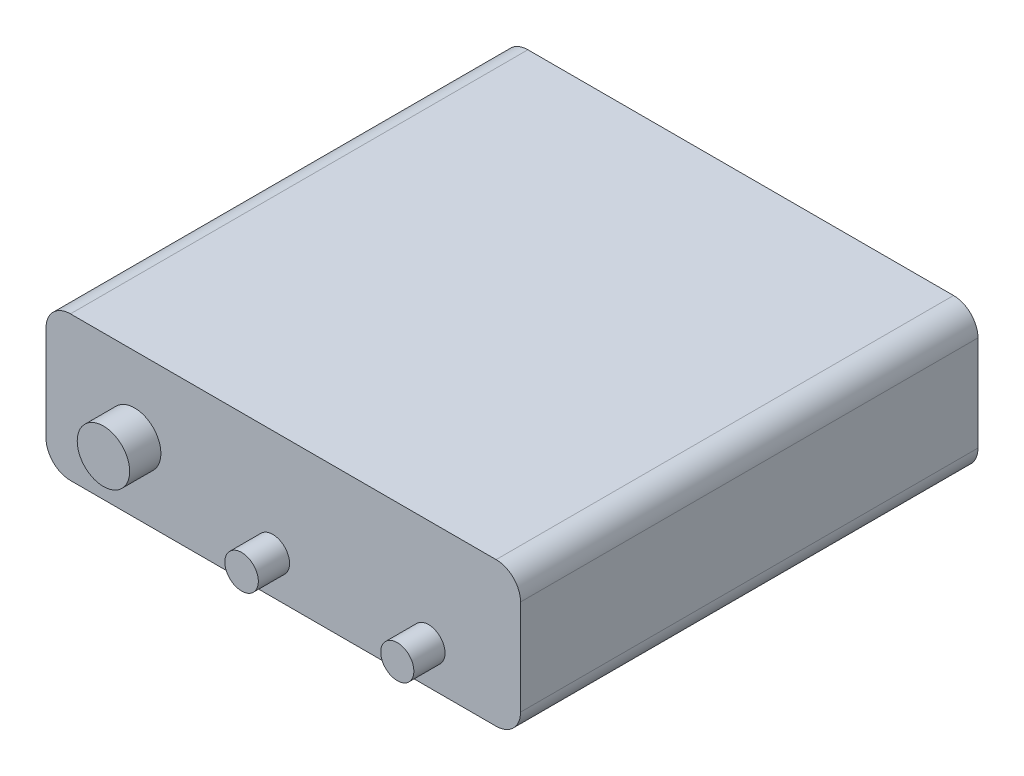
ISO-10303-21;
HEADER;
FILE_DESCRIPTION(('STEP AP214'),'2;1');
FILE_NAME('part.step','',(''),(''),'','','');
FILE_SCHEMA(('AUTOMOTIVE_DESIGN { 1 0 10303 214 1 1 1 1 }'));
ENDSEC;
DATA;
#1=APPLICATION_CONTEXT('core data for automotive mechanical design processes');
#2=APPLICATION_PROTOCOL_DEFINITION('international standard','automotive_design',2000,#1);
#3=PRODUCT_CONTEXT('',#1,'mechanical');
#4=PRODUCT('Part','Part','',(#3));
#5=PRODUCT_RELATED_PRODUCT_CATEGORY('part','',(#4));
#6=PRODUCT_DEFINITION_FORMATION('','',#4);
#7=PRODUCT_DEFINITION_CONTEXT('part definition',#1,'design');
#8=PRODUCT_DEFINITION('design','',#6,#7);
#9=PRODUCT_DEFINITION_SHAPE('','',#8);
#10=(LENGTH_UNIT() NAMED_UNIT(*) SI_UNIT(.MILLI.,.METRE.));
#11=(NAMED_UNIT(*) PLANE_ANGLE_UNIT() SI_UNIT($,.RADIAN.));
#12=(NAMED_UNIT(*) SI_UNIT($,.STERADIAN.) SOLID_ANGLE_UNIT());
#13=UNCERTAINTY_MEASURE_WITH_UNIT(LENGTH_MEASURE(1.E-05),#10,'distance_accuracy_value','');
#14=(GEOMETRIC_REPRESENTATION_CONTEXT(3) GLOBAL_UNCERTAINTY_ASSIGNED_CONTEXT((#13)) GLOBAL_UNIT_ASSIGNED_CONTEXT((#10,
#11,#12)) REPRESENTATION_CONTEXT('',''));
#15=CARTESIAN_POINT('',(0.,0.,0.));
#16=DIRECTION('',(0.,0.,1.));
#17=DIRECTION('',(1.,0.,0.));
#18=AXIS2_PLACEMENT_3D('',#15,#16,#17);
#19=CARTESIAN_POINT('',(0.,59.944,0.));
#20=DIRECTION('',(-1.,0.,0.));
#21=DIRECTION('',(0.,0.,1.));
#22=AXIS2_PLACEMENT_3D('',#19,#20,#21);
#23=PLANE('',#22);
#24=DIRECTION('',(0.,-1.,0.));
#25=VECTOR('',#24,1.);
#26=CARTESIAN_POINT('',(0.,59.944,189.992));
#27=LINE('',#26,#25);
#28=CARTESIAN_POINT('',(0.,49.784,189.992));
#29=VERTEX_POINT('',#28);
#30=CARTESIAN_POINT('',(0.,10.16,189.992));
#31=VERTEX_POINT('',#30);
#32=EDGE_CURVE('E130',#29,#31,#27,.T.);
#33=ORIENTED_EDGE('',*,*,#32,.T.);
#34=DIRECTION('',(0.,0.,-1.));
#35=VECTOR('',#34,1.);
#36=CARTESIAN_POINT('',(0.,10.16,0.));
#37=LINE('',#36,#35);
#38=CARTESIAN_POINT('',(0.,10.16,0.));
#39=VERTEX_POINT('',#38);
#40=EDGE_CURVE('E150',#31,#39,#37,.T.);
#41=ORIENTED_EDGE('',*,*,#40,.T.);
#42=DIRECTION('',(0.,-1.,0.));
#43=VECTOR('',#42,1.);
#44=CARTESIAN_POINT('',(0.,59.944,0.));
#45=LINE('',#44,#43);
#46=CARTESIAN_POINT('',(0.,49.784,0.));
#47=VERTEX_POINT('',#46);
#48=EDGE_CURVE('E122',#47,#39,#45,.T.);
#49=ORIENTED_EDGE('',*,*,#48,.F.);
#50=DIRECTION('',(0.,0.,-1.));
#51=VECTOR('',#50,1.);
#52=CARTESIAN_POINT('',(0.,49.784,0.));
#53=LINE('',#52,#51);
#54=EDGE_CURVE('E107',#47,#29,#53,.F.);
#55=ORIENTED_EDGE('',*,*,#54,.T.);
#56=EDGE_LOOP('',(#33,#41,#49,#55));
#57=FACE_BOUND('',#56,.T.);
#58=ADVANCED_FACE('F36',(#57),#23,.F.);
#59=CARTESIAN_POINT('',(0.,59.944,0.));
#60=DIRECTION('',(0.,0.,1.));
#61=DIRECTION('',(1.,0.,0.));
#62=AXIS2_PLACEMENT_3D('',#59,#60,#61);
#63=PLANE('',#62);
#64=DIRECTION('',(-1.,0.,0.));
#65=VECTOR('',#64,1.);
#66=CARTESIAN_POINT('',(0.,0.,0.));
#67=LINE('',#66,#65);
#68=CARTESIAN_POINT('',(-10.16,0.,0.));
#69=VERTEX_POINT('',#68);
#70=CARTESIAN_POINT('',(-186.944,0.,0.));
#71=VERTEX_POINT('',#70);
#72=EDGE_CURVE('E132',#69,#71,#67,.T.);
#73=ORIENTED_EDGE('',*,*,#72,.T.);
#74=CARTESIAN_POINT('',(-186.944,10.16,0.));
#75=DIRECTION('',(0.,0.,1.));
#76=DIRECTION('',(1.,0.,0.));
#77=AXIS2_PLACEMENT_3D('',#74,#75,#76);
#78=CIRCLE('',#77,10.16);
#79=CARTESIAN_POINT('',(-197.104,10.16,0.));
#80=VERTEX_POINT('',#79);
#81=EDGE_CURVE('E172',#71,#80,#78,.F.);
#82=ORIENTED_EDGE('',*,*,#81,.T.);
#83=DIRECTION('',(0.,-1.,0.));
#84=VECTOR('',#83,1.);
#85=CARTESIAN_POINT('',(-197.104,59.944,0.));
#86=LINE('',#85,#84);
#87=CARTESIAN_POINT('',(-197.104,49.784,0.));
#88=VERTEX_POINT('',#87);
#89=EDGE_CURVE('E143',#88,#80,#86,.T.);
#90=ORIENTED_EDGE('',*,*,#89,.F.);
#91=CARTESIAN_POINT('',(-186.944,49.784,0.));
#92=DIRECTION('',(0.,0.,1.));
#93=DIRECTION('',(1.,0.,0.));
#94=AXIS2_PLACEMENT_3D('',#91,#92,#93);
#95=CIRCLE('',#94,10.16);
#96=CARTESIAN_POINT('',(-186.944,59.944,0.));
#97=VERTEX_POINT('',#96);
#98=EDGE_CURVE('E127',#88,#97,#95,.F.);
#99=ORIENTED_EDGE('',*,*,#98,.T.);
#100=DIRECTION('',(-1.,0.,0.));
#101=VECTOR('',#100,1.);
#102=CARTESIAN_POINT('',(0.,59.944,0.));
#103=LINE('',#102,#101);
#104=CARTESIAN_POINT('',(-10.16,59.944,0.));
#105=VERTEX_POINT('',#104);
#106=EDGE_CURVE('E117',#105,#97,#103,.T.);
#107=ORIENTED_EDGE('',*,*,#106,.F.);
#108=CARTESIAN_POINT('',(-10.16,49.784,0.));
#109=DIRECTION('',(0.,0.,1.));
#110=DIRECTION('',(1.,0.,0.));
#111=AXIS2_PLACEMENT_3D('',#108,#109,#110);
#112=CIRCLE('',#111,10.16);
#113=EDGE_CURVE('E102',#105,#47,#112,.F.);
#114=ORIENTED_EDGE('',*,*,#113,.T.);
#115=ORIENTED_EDGE('',*,*,#48,.T.);
#116=CARTESIAN_POINT('',(-10.16,10.16,0.));
#117=DIRECTION('',(0.,0.,1.));
#118=DIRECTION('',(1.,0.,0.));
#119=AXIS2_PLACEMENT_3D('',#116,#117,#118);
#120=CIRCLE('',#119,10.16);
#121=EDGE_CURVE('E153',#39,#69,#120,.F.);
#122=ORIENTED_EDGE('',*,*,#121,.T.);
#123=EDGE_LOOP('',(#73,#82,#90,#99,#107,#114,#115,#122));
#124=FACE_BOUND('',#123,.T.);
#125=ADVANCED_FACE('F124',(#124),#63,.F.);
#126=CARTESIAN_POINT('',(-197.104,59.944,0.));
#127=DIRECTION('',(1.,0.,0.));
#128=DIRECTION('',(0.,0.,-1.));
#129=AXIS2_PLACEMENT_3D('',#126,#127,#128);
#130=PLANE('',#129);
#131=ORIENTED_EDGE('',*,*,#89,.T.);
#132=DIRECTION('',(0.,0.,1.));
#133=VECTOR('',#132,1.);
#134=CARTESIAN_POINT('',(-197.104,10.16,189.992));
#135=LINE('',#134,#133);
#136=CARTESIAN_POINT('',(-197.104,10.16,189.992));
#137=VERTEX_POINT('',#136);
#138=EDGE_CURVE('E167',#80,#137,#135,.T.);
#139=ORIENTED_EDGE('',*,*,#138,.T.);
#140=DIRECTION('',(0.,-1.,0.));
#141=VECTOR('',#140,1.);
#142=CARTESIAN_POINT('',(-197.104,59.944,189.992));
#143=LINE('',#142,#141);
#144=CARTESIAN_POINT('',(-197.104,49.784,189.992));
#145=VERTEX_POINT('',#144);
#146=EDGE_CURVE('E141',#145,#137,#143,.T.);
#147=ORIENTED_EDGE('',*,*,#146,.F.);
#148=DIRECTION('',(0.,0.,1.));
#149=VECTOR('',#148,1.);
#150=CARTESIAN_POINT('',(-197.104,49.784,0.));
#151=LINE('',#150,#149);
#152=EDGE_CURVE('E164',#145,#88,#151,.F.);
#153=ORIENTED_EDGE('',*,*,#152,.T.);
#154=EDGE_LOOP('',(#131,#139,#147,#153));
#155=FACE_BOUND('',#154,.T.);
#156=ADVANCED_FACE('F184',(#155),#130,.F.);
#157=CARTESIAN_POINT('',(0.,59.944,189.992));
#158=DIRECTION('',(0.,0.,-1.));
#159=DIRECTION('',(-1.,0.,0.));
#160=AXIS2_PLACEMENT_3D('',#157,#158,#159);
#161=PLANE('',#160);
#162=CARTESIAN_POINT('',(-38.24316685751,15.6747262686382,189.992));
#163=DIRECTION('',(0.,0.,-1.));
#164=DIRECTION('',(-1.,0.,0.));
#165=AXIS2_PLACEMENT_3D('',#162,#163,#164);
#166=CIRCLE('',#165,6.87161730386582);
#167=CARTESIAN_POINT('',(-45.1147841613758,15.6747262686382,189.992));
#168=VERTEX_POINT('',#167);
#169=EDGE_CURVE('E11',#168,#168,#166,.F.);
#170=ORIENTED_EDGE('',*,*,#169,.F.);
#171=EDGE_LOOP('',(#170));
#172=FACE_BOUND('',#171,.T.);
#173=CARTESIAN_POINT('',(-102.91026687389,15.6747262686382,189.992));
#174=DIRECTION('',(0.,0.,-1.));
#175=DIRECTION('',(-1.,0.,0.));
#176=AXIS2_PLACEMENT_3D('',#173,#174,#175);
#177=CIRCLE('',#176,6.95669831574314);
#178=CARTESIAN_POINT('',(-109.866965189633,15.6747262686382,189.992));
#179=VERTEX_POINT('',#178);
#180=EDGE_CURVE('E44',#179,#179,#177,.F.);
#181=ORIENTED_EDGE('',*,*,#180,.F.);
#182=EDGE_LOOP('',(#181));
#183=FACE_BOUND('',#182,.T.);
#184=CARTESIAN_POINT('',(-160.289066683505,28.5286375423858,189.992));
#185=DIRECTION('',(0.,0.,-1.));
#186=DIRECTION('',(-1.,0.,0.));
#187=AXIS2_PLACEMENT_3D('',#184,#185,#186);
#188=CIRCLE('',#187,10.8928249125496);
#189=CARTESIAN_POINT('',(-171.181891596055,28.5286375423858,189.992));
#190=VERTEX_POINT('',#189);
#191=EDGE_CURVE('E174',#190,#190,#188,.F.);
#192=ORIENTED_EDGE('',*,*,#191,.F.);
#193=EDGE_LOOP('',(#192));
#194=FACE_BOUND('',#193,.T.);
#195=ORIENTED_EDGE('',*,*,#146,.T.);
#196=CARTESIAN_POINT('',(-186.944,10.16,189.992));
#197=DIRECTION('',(0.,0.,-1.));
#198=DIRECTION('',(-1.,0.,0.));
#199=AXIS2_PLACEMENT_3D('',#196,#197,#198);
#200=CIRCLE('',#199,10.16);
#201=CARTESIAN_POINT('',(-186.944,0.,189.992));
#202=VERTEX_POINT('',#201);
#203=EDGE_CURVE('E59',#137,#202,#200,.F.);
#204=ORIENTED_EDGE('',*,*,#203,.T.);
#205=DIRECTION('',(1.,0.,0.));
#206=VECTOR('',#205,1.);
#207=CARTESIAN_POINT('',(0.,0.,189.992));
#208=LINE('',#207,#206);
#209=CARTESIAN_POINT('',(-10.16,0.,189.992));
#210=VERTEX_POINT('',#209);
#211=EDGE_CURVE('E128',#202,#210,#208,.T.);
#212=ORIENTED_EDGE('',*,*,#211,.T.);
#213=CARTESIAN_POINT('',(-10.16,10.16,189.992));
#214=DIRECTION('',(0.,0.,-1.));
#215=DIRECTION('',(-1.,0.,0.));
#216=AXIS2_PLACEMENT_3D('',#213,#214,#215);
#217=CIRCLE('',#216,10.16);
#218=EDGE_CURVE('E158',#210,#31,#217,.F.);
#219=ORIENTED_EDGE('',*,*,#218,.T.);
#220=ORIENTED_EDGE('',*,*,#32,.F.);
#221=CARTESIAN_POINT('',(-10.16,49.784,189.992));
#222=DIRECTION('',(0.,0.,-1.));
#223=DIRECTION('',(-1.,0.,0.));
#224=AXIS2_PLACEMENT_3D('',#221,#222,#223);
#225=CIRCLE('',#224,10.16);
#226=CARTESIAN_POINT('',(-10.16,59.944,189.992));
#227=VERTEX_POINT('',#226);
#228=EDGE_CURVE('E148',#29,#227,#225,.F.);
#229=ORIENTED_EDGE('',*,*,#228,.T.);
#230=DIRECTION('',(1.,0.,0.));
#231=VECTOR('',#230,1.);
#232=CARTESIAN_POINT('',(0.,59.944,189.992));
#233=LINE('',#232,#231);
#234=CARTESIAN_POINT('',(-186.944,59.944,189.992));
#235=VERTEX_POINT('',#234);
#236=EDGE_CURVE('E120',#235,#227,#233,.T.);
#237=ORIENTED_EDGE('',*,*,#236,.F.);
#238=CARTESIAN_POINT('',(-186.944,49.784,189.992));
#239=DIRECTION('',(0.,0.,-1.));
#240=DIRECTION('',(-1.,0.,0.));
#241=AXIS2_PLACEMENT_3D('',#238,#239,#240);
#242=CIRCLE('',#241,10.16);
#243=EDGE_CURVE('E162',#235,#145,#242,.F.);
#244=ORIENTED_EDGE('',*,*,#243,.T.);
#245=EDGE_LOOP('',(#195,#204,#212,#219,#220,#229,#237,#244));
#246=FACE_BOUND('',#245,.T.);
#247=ADVANCED_FACE('F181',(#172,#183,#194,#246),#161,.F.);
#248=CARTESIAN_POINT('',(0.,59.944,0.));
#249=DIRECTION('',(0.,-1.,0.));
#250=DIRECTION('',(0.,0.,-1.));
#251=AXIS2_PLACEMENT_3D('',#248,#249,#250);
#252=PLANE('',#251);
#253=ORIENTED_EDGE('',*,*,#106,.T.);
#254=DIRECTION('',(0.,0.,1.));
#255=VECTOR('',#254,1.);
#256=CARTESIAN_POINT('',(-186.944,59.944,0.));
#257=LINE('',#256,#255);
#258=EDGE_CURVE('E160',#97,#235,#257,.T.);
#259=ORIENTED_EDGE('',*,*,#258,.T.);
#260=ORIENTED_EDGE('',*,*,#236,.T.);
#261=DIRECTION('',(0.,0.,-1.));
#262=VECTOR('',#261,1.);
#263=CARTESIAN_POINT('',(-10.16,59.944,0.));
#264=LINE('',#263,#262);
#265=EDGE_CURVE('E106',#227,#105,#264,.T.);
#266=ORIENTED_EDGE('',*,*,#265,.T.);
#267=EDGE_LOOP('',(#253,#259,#260,#266));
#268=FACE_BOUND('',#267,.T.);
#269=ADVANCED_FACE('F115',(#268),#252,.F.);
#270=CARTESIAN_POINT('',(0.,0.,0.));
#271=DIRECTION('',(0.,-1.,0.));
#272=DIRECTION('',(0.,0.,-1.));
#273=AXIS2_PLACEMENT_3D('',#270,#271,#272);
#274=PLANE('',#273);
#275=ORIENTED_EDGE('',*,*,#211,.F.);
#276=DIRECTION('',(0.,0.,1.));
#277=VECTOR('',#276,1.);
#278=CARTESIAN_POINT('',(-186.944,0.,0.));
#279=LINE('',#278,#277);
#280=EDGE_CURVE('E51',#202,#71,#279,.F.);
#281=ORIENTED_EDGE('',*,*,#280,.T.);
#282=ORIENTED_EDGE('',*,*,#72,.F.);
#283=DIRECTION('',(0.,0.,-1.));
#284=VECTOR('',#283,1.);
#285=CARTESIAN_POINT('',(-10.16,0.,189.992));
#286=LINE('',#285,#284);
#287=EDGE_CURVE('E155',#69,#210,#286,.F.);
#288=ORIENTED_EDGE('',*,*,#287,.T.);
#289=EDGE_LOOP('',(#275,#281,#282,#288));
#290=FACE_BOUND('',#289,.T.);
#291=ADVANCED_FACE('F202',(#290),#274,.T.);
#292=CARTESIAN_POINT('',(-10.16,49.784,0.));
#293=DIRECTION('',(0.,0.,-1.));
#294=DIRECTION('',(-1.,0.,0.));
#295=AXIS2_PLACEMENT_3D('',#292,#293,#294);
#296=CYLINDRICAL_SURFACE('',#295,10.16);
#297=ORIENTED_EDGE('',*,*,#228,.F.);
#298=ORIENTED_EDGE('',*,*,#54,.F.);
#299=ORIENTED_EDGE('',*,*,#113,.F.);
#300=ORIENTED_EDGE('',*,*,#265,.F.);
#301=EDGE_LOOP('',(#297,#298,#299,#300));
#302=FACE_BOUND('',#301,.T.);
#303=ADVANCED_FACE('F105',(#302),#296,.T.);
#304=CARTESIAN_POINT('',(-10.16,10.16,0.));
#305=DIRECTION('',(0.,0.,1.));
#306=DIRECTION('',(1.,0.,0.));
#307=AXIS2_PLACEMENT_3D('',#304,#305,#306);
#308=CYLINDRICAL_SURFACE('',#307,10.16);
#309=ORIENTED_EDGE('',*,*,#218,.F.);
#310=ORIENTED_EDGE('',*,*,#287,.F.);
#311=ORIENTED_EDGE('',*,*,#121,.F.);
#312=ORIENTED_EDGE('',*,*,#40,.F.);
#313=EDGE_LOOP('',(#309,#310,#311,#312));
#314=FACE_BOUND('',#313,.T.);
#315=ADVANCED_FACE('F199',(#314),#308,.T.);
#316=CARTESIAN_POINT('',(-186.944,49.784,0.));
#317=DIRECTION('',(0.,0.,1.));
#318=DIRECTION('',(1.,0.,0.));
#319=AXIS2_PLACEMENT_3D('',#316,#317,#318);
#320=CYLINDRICAL_SURFACE('',#319,10.16);
#321=ORIENTED_EDGE('',*,*,#98,.F.);
#322=ORIENTED_EDGE('',*,*,#152,.F.);
#323=ORIENTED_EDGE('',*,*,#243,.F.);
#324=ORIENTED_EDGE('',*,*,#258,.F.);
#325=EDGE_LOOP('',(#321,#322,#323,#324));
#326=FACE_BOUND('',#325,.T.);
#327=ADVANCED_FACE('F193',(#326),#320,.T.);
#328=CARTESIAN_POINT('',(-186.944,10.16,0.));
#329=DIRECTION('',(0.,0.,-1.));
#330=DIRECTION('',(-1.,0.,0.));
#331=AXIS2_PLACEMENT_3D('',#328,#329,#330);
#332=CYLINDRICAL_SURFACE('',#331,10.16);
#333=ORIENTED_EDGE('',*,*,#81,.F.);
#334=ORIENTED_EDGE('',*,*,#280,.F.);
#335=ORIENTED_EDGE('',*,*,#203,.F.);
#336=ORIENTED_EDGE('',*,*,#138,.F.);
#337=EDGE_LOOP('',(#333,#334,#335,#336));
#338=FACE_BOUND('',#337,.T.);
#339=ADVANCED_FACE('F38',(#338),#332,.T.);
#340=CARTESIAN_POINT('',(-160.289066683505,28.5286375423858,202.946));
#341=DIRECTION('',(0.,0.,-1.));
#342=DIRECTION('',(-1.,0.,0.));
#343=AXIS2_PLACEMENT_3D('',#340,#341,#342);
#344=CYLINDRICAL_SURFACE('',#343,10.8928249125496);
#345=CARTESIAN_POINT('',(-160.289066683505,28.5286375423858,202.946));
#346=DIRECTION('',(0.,0.,1.));
#347=DIRECTION('',(1.,0.,0.));
#348=AXIS2_PLACEMENT_3D('',#345,#346,#347);
#349=CIRCLE('',#348,10.8928249125496);
#350=CARTESIAN_POINT('',(-149.396241770956,28.5286375423858,202.946));
#351=VERTEX_POINT('',#350);
#352=EDGE_CURVE('E135',#351,#351,#349,.T.);
#353=ORIENTED_EDGE('',*,*,#352,.F.);
#354=EDGE_LOOP('',(#353));
#355=FACE_BOUND('',#354,.T.);
#356=ORIENTED_EDGE('',*,*,#191,.T.);
#357=EDGE_LOOP('',(#356));
#358=FACE_BOUND('',#357,.T.);
#359=ADVANCED_FACE('F205',(#355,#358),#344,.T.);
#360=CARTESIAN_POINT('',(-160.289066683505,28.5286375423858,202.946));
#361=DIRECTION('',(0.,0.,1.));
#362=DIRECTION('',(1.,0.,0.));
#363=AXIS2_PLACEMENT_3D('',#360,#361,#362);
#364=PLANE('',#363);
#365=ORIENTED_EDGE('',*,*,#352,.T.);
#366=EDGE_LOOP('',(#365));
#367=FACE_BOUND('',#366,.T.);
#368=ADVANCED_FACE('F210',(#367),#364,.T.);
#369=CARTESIAN_POINT('',(-102.91026687389,15.6747262686382,202.946));
#370=DIRECTION('',(0.,0.,-1.));
#371=DIRECTION('',(-1.,0.,0.));
#372=AXIS2_PLACEMENT_3D('',#369,#370,#371);
#373=CYLINDRICAL_SURFACE('',#372,6.95669831574314);
#374=CARTESIAN_POINT('',(-102.91026687389,15.6747262686382,202.946));
#375=DIRECTION('',(0.,0.,1.));
#376=DIRECTION('',(1.,0.,0.));
#377=AXIS2_PLACEMENT_3D('',#374,#375,#376);
#378=CIRCLE('',#377,6.95669831574314);
#379=CARTESIAN_POINT('',(-95.9535685581465,15.6747262686382,202.946));
#380=VERTEX_POINT('',#379);
#381=EDGE_CURVE('E339',#380,#380,#378,.T.);
#382=ORIENTED_EDGE('',*,*,#381,.F.);
#383=EDGE_LOOP('',(#382));
#384=FACE_BOUND('',#383,.T.);
#385=ORIENTED_EDGE('',*,*,#180,.T.);
#386=EDGE_LOOP('',(#385));
#387=FACE_BOUND('',#386,.T.);
#388=ADVANCED_FACE('F179',(#384,#387),#373,.T.);
#389=CARTESIAN_POINT('',(-102.91026687389,15.6747262686382,202.946));
#390=DIRECTION('',(0.,0.,1.));
#391=DIRECTION('',(1.,0.,0.));
#392=AXIS2_PLACEMENT_3D('',#389,#390,#391);
#393=PLANE('',#392);
#394=ORIENTED_EDGE('',*,*,#381,.T.);
#395=EDGE_LOOP('',(#394));
#396=FACE_BOUND('',#395,.T.);
#397=ADVANCED_FACE('F300',(#396),#393,.T.);
#398=CARTESIAN_POINT('',(-38.24316685751,15.6747262686382,202.946));
#399=DIRECTION('',(0.,0.,-1.));
#400=DIRECTION('',(-1.,0.,0.));
#401=AXIS2_PLACEMENT_3D('',#398,#399,#400);
#402=CYLINDRICAL_SURFACE('',#401,6.87161730386582);
#403=CARTESIAN_POINT('',(-38.24316685751,15.6747262686382,202.946));
#404=DIRECTION('',(0.,0.,1.));
#405=DIRECTION('',(1.,0.,0.));
#406=AXIS2_PLACEMENT_3D('',#403,#404,#405);
#407=CIRCLE('',#406,6.87161730386582);
#408=CARTESIAN_POINT('',(-31.3715495536442,15.6747262686382,202.946));
#409=VERTEX_POINT('',#408);
#410=EDGE_CURVE('E338',#409,#409,#407,.T.);
#411=ORIENTED_EDGE('',*,*,#410,.F.);
#412=EDGE_LOOP('',(#411));
#413=FACE_BOUND('',#412,.T.);
#414=ORIENTED_EDGE('',*,*,#169,.T.);
#415=EDGE_LOOP('',(#414));
#416=FACE_BOUND('',#415,.T.);
#417=ADVANCED_FACE('F309',(#413,#416),#402,.T.);
#418=CARTESIAN_POINT('',(-38.24316685751,15.6747262686382,202.946));
#419=DIRECTION('',(0.,0.,1.));
#420=DIRECTION('',(1.,0.,0.));
#421=AXIS2_PLACEMENT_3D('',#418,#419,#420);
#422=PLANE('',#421);
#423=ORIENTED_EDGE('',*,*,#410,.T.);
#424=EDGE_LOOP('',(#423));
#425=FACE_BOUND('',#424,.T.);
#426=ADVANCED_FACE('F318',(#425),#422,.T.);
#427=CLOSED_SHELL('',(#58,#125,#156,#247,#269,#291,#303,#315,#327,#339,#359,#368,#388,#397,#417,#426));
#428=MANIFOLD_SOLID_BREP('B2',#427);
#429=ADVANCED_BREP_SHAPE_REPRESENTATION('',(#18,#428),#14);
#430=SHAPE_DEFINITION_REPRESENTATION(#9,#429);
ENDSEC;
END-ISO-10303-21;
